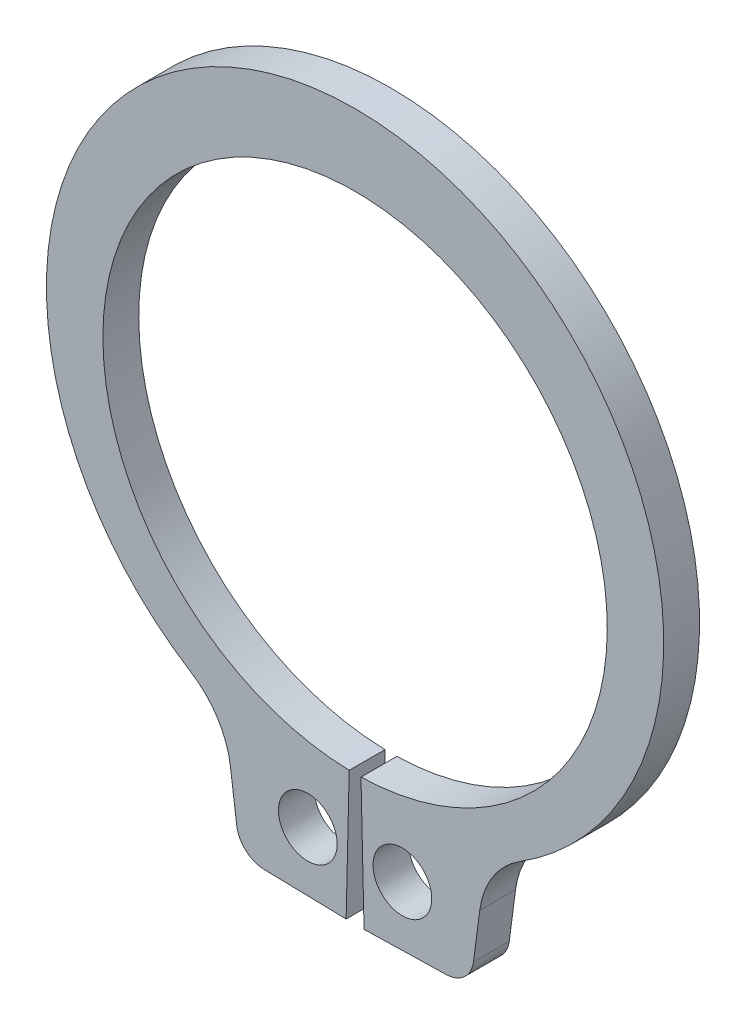
ISO-10303-21;
HEADER;
FILE_DESCRIPTION(('STEP AP214'),'2;1');
FILE_NAME('part.step','',(''),(''),'','','');
FILE_SCHEMA(('AUTOMOTIVE_DESIGN { 1 0 10303 214 1 1 1 1 }'));
ENDSEC;
DATA;
#1=APPLICATION_CONTEXT('core data for automotive mechanical design processes');
#2=APPLICATION_PROTOCOL_DEFINITION('international standard','automotive_design',2000,#1);
#3=PRODUCT_CONTEXT('',#1,'mechanical');
#4=PRODUCT('Part','Part','',(#3));
#5=PRODUCT_RELATED_PRODUCT_CATEGORY('part','',(#4));
#6=PRODUCT_DEFINITION_FORMATION('','',#4);
#7=PRODUCT_DEFINITION_CONTEXT('part definition',#1,'design');
#8=PRODUCT_DEFINITION('design','',#6,#7);
#9=PRODUCT_DEFINITION_SHAPE('','',#8);
#10=(LENGTH_UNIT() NAMED_UNIT(*) SI_UNIT(.MILLI.,.METRE.));
#11=(NAMED_UNIT(*) PLANE_ANGLE_UNIT() SI_UNIT($,.RADIAN.));
#12=(NAMED_UNIT(*) SI_UNIT($,.STERADIAN.) SOLID_ANGLE_UNIT());
#13=UNCERTAINTY_MEASURE_WITH_UNIT(LENGTH_MEASURE(1.E-05),#10,'distance_accuracy_value','');
#14=(GEOMETRIC_REPRESENTATION_CONTEXT(3) GLOBAL_UNCERTAINTY_ASSIGNED_CONTEXT((#13)) GLOBAL_UNIT_ASSIGNED_CONTEXT((#10,
#11,#12)) REPRESENTATION_CONTEXT('',''));
#15=CARTESIAN_POINT('',(0.,0.,0.));
#16=DIRECTION('',(0.,0.,1.));
#17=DIRECTION('',(1.,0.,0.));
#18=AXIS2_PLACEMENT_3D('',#15,#16,#17);
#19=CARTESIAN_POINT('',(0.,0.,-0.635));
#20=DIRECTION('',(0.,0.,1.));
#21=DIRECTION('',(1.,0.,0.));
#22=AXIS2_PLACEMENT_3D('',#19,#20,#21);
#23=CYLINDRICAL_SURFACE('',#22,4.4704);
#24=CARTESIAN_POINT('',(0.,0.,0.));
#25=DIRECTION('',(0.,0.,-1.));
#26=DIRECTION('',(1.,0.,0.));
#27=AXIS2_PLACEMENT_3D('',#24,#25,#26);
#28=CIRCLE('',#27,4.4704);
#29=CARTESIAN_POINT('',(-0.104644194756554,-4.46917506398035,0.));
#30=VERTEX_POINT('',#29);
#31=CARTESIAN_POINT('',(0.104644194756554,-4.46917506398035,0.));
#32=VERTEX_POINT('',#31);
#33=EDGE_CURVE('E157',#30,#32,#28,.T.);
#34=ORIENTED_EDGE('',*,*,#33,.F.);
#35=DIRECTION('',(0.,0.,1.));
#36=VECTOR('',#35,1.);
#37=CARTESIAN_POINT('',(-0.104644194756554,-4.46917506398035,-0.635));
#38=LINE('',#37,#36);
#39=CARTESIAN_POINT('',(-0.104644194756554,-4.46917506398035,-0.635));
#40=VERTEX_POINT('',#39);
#41=EDGE_CURVE('E11',#40,#30,#38,.T.);
#42=ORIENTED_EDGE('',*,*,#41,.F.);
#43=CARTESIAN_POINT('',(0.,0.,-0.635));
#44=DIRECTION('',(0.,0.,-1.));
#45=DIRECTION('',(1.,0.,0.));
#46=AXIS2_PLACEMENT_3D('',#43,#44,#45);
#47=CIRCLE('',#46,4.4704);
#48=CARTESIAN_POINT('',(0.104644194756554,-4.46917506398035,-0.635));
#49=VERTEX_POINT('',#48);
#50=EDGE_CURVE('E190',#40,#49,#47,.T.);
#51=ORIENTED_EDGE('',*,*,#50,.T.);
#52=DIRECTION('',(0.,0.,1.));
#53=VECTOR('',#52,1.);
#54=CARTESIAN_POINT('',(0.104644194756554,-4.46917506398035,-0.635));
#55=LINE('',#54,#53);
#56=EDGE_CURVE('E39',#49,#32,#55,.T.);
#57=ORIENTED_EDGE('',*,*,#56,.T.);
#58=EDGE_LOOP('',(#34,#42,#51,#57));
#59=FACE_BOUND('',#58,.T.);
#60=ADVANCED_FACE('F36',(#59),#23,.F.);
#61=CARTESIAN_POINT('',(-0.104644194756554,-4.46917506398035,-0.635));
#62=DIRECTION('',(0.99972598961622,-0.0234082397003745,0.));
#63=DIRECTION('',(0.0234082397003745,0.99972598961622,0.));
#64=AXIS2_PLACEMENT_3D('',#61,#62,#63);
#65=PLANE('',#64);
#66=DIRECTION('',(0.0234082397003745,0.99972598961622,0.));
#67=VECTOR('',#66,1.);
#68=CARTESIAN_POINT('',(-0.104644194756554,-4.46917506398035,0.));
#69=LINE('',#68,#67);
#70=CARTESIAN_POINT('',(-0.15875,-6.77994171637928,0.));
#71=VERTEX_POINT('',#70);
#72=EDGE_CURVE('E188',#71,#30,#69,.T.);
#73=ORIENTED_EDGE('',*,*,#72,.F.);
#74=DIRECTION('',(0.,0.,1.));
#75=VECTOR('',#74,1.);
#76=CARTESIAN_POINT('',(-0.15875,-6.77994171637928,-0.635));
#77=LINE('',#76,#75);
#78=CARTESIAN_POINT('',(-0.15875,-6.77994171637928,-0.635));
#79=VERTEX_POINT('',#78);
#80=EDGE_CURVE('E45',#79,#71,#77,.T.);
#81=ORIENTED_EDGE('',*,*,#80,.F.);
#82=DIRECTION('',(0.0234082397003745,0.99972598961622,0.));
#83=VECTOR('',#82,1.);
#84=CARTESIAN_POINT('',(-0.104644194756554,-4.46917506398035,-0.635));
#85=LINE('',#84,#83);
#86=EDGE_CURVE('E147',#79,#40,#85,.T.);
#87=ORIENTED_EDGE('',*,*,#86,.T.);
#88=ORIENTED_EDGE('',*,*,#41,.T.);
#89=EDGE_LOOP('',(#73,#81,#87,#88));
#90=FACE_BOUND('',#89,.T.);
#91=ADVANCED_FACE('F210',(#90),#65,.T.);
#92=CARTESIAN_POINT('',(-0.15875,-6.77994171637928,-0.635));
#93=DIRECTION('',(-0.0234082397003748,-0.99972598961622,0.));
#94=DIRECTION('',(0.99972598961622,-0.0234082397003748,0.));
#95=AXIS2_PLACEMENT_3D('',#92,#93,#94);
#96=PLANE('',#95);
#97=DIRECTION('',(0.99972598961622,-0.0234082397003748,0.));
#98=VECTOR('',#97,1.);
#99=CARTESIAN_POINT('',(-0.15875,-6.77994171637928,0.));
#100=LINE('',#99,#98);
#101=CARTESIAN_POINT('',(-1.61409910187213,-6.74586521844065,0.));
#102=VERTEX_POINT('',#101);
#103=EDGE_CURVE('E134',#102,#71,#100,.T.);
#104=ORIENTED_EDGE('',*,*,#103,.F.);
#105=DIRECTION('',(0.,0.,1.));
#106=VECTOR('',#105,1.);
#107=CARTESIAN_POINT('',(-1.61409910187213,-6.74586521844065,-0.635));
#108=LINE('',#107,#106);
#109=CARTESIAN_POINT('',(-1.61409910187213,-6.74586521844065,-0.635));
#110=VERTEX_POINT('',#109);
#111=EDGE_CURVE('E129',#110,#102,#108,.T.);
#112=ORIENTED_EDGE('',*,*,#111,.F.);
#113=DIRECTION('',(0.99972598961622,-0.0234082397003748,0.));
#114=VECTOR('',#113,1.);
#115=CARTESIAN_POINT('',(-0.15875,-6.77994171637928,-0.635));
#116=LINE('',#115,#114);
#117=EDGE_CURVE('E132',#110,#79,#116,.T.);
#118=ORIENTED_EDGE('',*,*,#117,.T.);
#119=ORIENTED_EDGE('',*,*,#80,.T.);
#120=EDGE_LOOP('',(#104,#112,#118,#119));
#121=FACE_BOUND('',#120,.T.);
#122=ADVANCED_FACE('F131',(#121),#96,.T.);
#123=CARTESIAN_POINT('',(-1.60239498202195,-6.24600222363254,-0.635));
#124=DIRECTION('',(0.,0.,1.));
#125=DIRECTION('',(1.,0.,0.));
#126=AXIS2_PLACEMENT_3D('',#123,#124,#125);
#127=CYLINDRICAL_SURFACE('',#126,0.5);
#128=CARTESIAN_POINT('',(-1.60239498202195,-6.24600222363254,0.));
#129=DIRECTION('',(0.,0.,1.));
#130=DIRECTION('',(1.,0.,0.));
#131=AXIS2_PLACEMENT_3D('',#128,#129,#130);
#132=CIRCLE('',#131,0.5);
#133=CARTESIAN_POINT('',(-2.09811741270885,-6.31126531974257,0.));
#134=VERTEX_POINT('',#133);
#135=EDGE_CURVE('E185',#134,#102,#132,.T.);
#136=ORIENTED_EDGE('',*,*,#135,.F.);
#137=DIRECTION('',(0.,0.,1.));
#138=VECTOR('',#137,1.);
#139=CARTESIAN_POINT('',(-2.09811741270885,-6.31126531974257,-0.635));
#140=LINE('',#139,#138);
#141=CARTESIAN_POINT('',(-2.09811741270885,-6.31126531974257,-0.635));
#142=VERTEX_POINT('',#141);
#143=EDGE_CURVE('E139',#142,#134,#140,.T.);
#144=ORIENTED_EDGE('',*,*,#143,.F.);
#145=CARTESIAN_POINT('',(-1.60239498202195,-6.24600222363254,-0.635));
#146=DIRECTION('',(0.,0.,1.));
#147=DIRECTION('',(1.,0.,0.));
#148=AXIS2_PLACEMENT_3D('',#145,#146,#147);
#149=CIRCLE('',#148,0.5);
#150=EDGE_CURVE('E145',#142,#110,#149,.T.);
#151=ORIENTED_EDGE('',*,*,#150,.T.);
#152=ORIENTED_EDGE('',*,*,#111,.T.);
#153=EDGE_LOOP('',(#136,#144,#151,#152));
#154=FACE_BOUND('',#153,.T.);
#155=ADVANCED_FACE('F149',(#154),#127,.T.);
#156=CARTESIAN_POINT('',(-2.21001393120872,-5.46132687914755,-0.635));
#157=DIRECTION('',(-0.99144486137381,-0.130526192220053,0.));
#158=DIRECTION('',(0.130526192220053,-0.99144486137381,0.));
#159=AXIS2_PLACEMENT_3D('',#156,#157,#158);
#160=PLANE('',#159);
#161=DIRECTION('',(0.130526192220053,-0.99144486137381,0.));
#162=VECTOR('',#161,1.);
#163=CARTESIAN_POINT('',(-2.21001393120872,-5.46132687914755,0.));
#164=LINE('',#163,#162);
#165=CARTESIAN_POINT('',(-2.21001393120872,-5.46132687914755,0.));
#166=VERTEX_POINT('',#165);
#167=EDGE_CURVE('E182',#166,#134,#164,.T.);
#168=ORIENTED_EDGE('',*,*,#167,.F.);
#169=DIRECTION('',(0.,0.,1.));
#170=VECTOR('',#169,1.);
#171=CARTESIAN_POINT('',(-2.21001393120872,-5.46132687914755,-0.635));
#172=LINE('',#171,#170);
#173=CARTESIAN_POINT('',(-2.21001393120872,-5.46132687914755,-0.635));
#174=VERTEX_POINT('',#173);
#175=EDGE_CURVE('E194',#174,#166,#172,.T.);
#176=ORIENTED_EDGE('',*,*,#175,.F.);
#177=DIRECTION('',(0.130526192220053,-0.99144486137381,0.));
#178=VECTOR('',#177,1.);
#179=CARTESIAN_POINT('',(-2.21001393120872,-5.46132687914755,-0.635));
#180=LINE('',#179,#178);
#181=EDGE_CURVE('E150',#174,#142,#180,.T.);
#182=ORIENTED_EDGE('',*,*,#181,.T.);
#183=ORIENTED_EDGE('',*,*,#143,.T.);
#184=EDGE_LOOP('',(#168,#176,#182,#183));
#185=FACE_BOUND('',#184,.T.);
#186=ADVANCED_FACE('F223',(#185),#160,.T.);
#187=CARTESIAN_POINT('',(-3.73313206779057,-5.66184918594921,-0.635));
#188=DIRECTION('',(0.,0.,1.));
#189=DIRECTION('',(1.,0.,0.));
#190=AXIS2_PLACEMENT_3D('',#187,#188,#189);
#191=CYLINDRICAL_SURFACE('',#190,1.53626106294132);
#192=CARTESIAN_POINT('',(-3.73313206779057,-5.66184918594921,0.));
#193=DIRECTION('',(0.,0.,-1.));
#194=DIRECTION('',(1.,0.,0.));
#195=AXIS2_PLACEMENT_3D('',#192,#193,#194);
#196=CIRCLE('',#195,1.53626106294132);
#197=CARTESIAN_POINT('',(-2.91475044430294,-4.36171474219066,0.));
#198=VERTEX_POINT('',#197);
#199=EDGE_CURVE('E179',#198,#166,#196,.T.);
#200=ORIENTED_EDGE('',*,*,#199,.F.);
#201=DIRECTION('',(0.,0.,1.));
#202=VECTOR('',#201,1.);
#203=CARTESIAN_POINT('',(-2.91475044430294,-4.36171474219066,-0.635));
#204=LINE('',#203,#202);
#205=CARTESIAN_POINT('',(-2.91475044430294,-4.36171474219066,-0.635));
#206=VERTEX_POINT('',#205);
#207=EDGE_CURVE('E196',#206,#198,#204,.T.);
#208=ORIENTED_EDGE('',*,*,#207,.F.);
#209=CARTESIAN_POINT('',(-3.73313206779057,-5.66184918594921,-0.635));
#210=DIRECTION('',(0.,0.,-1.));
#211=DIRECTION('',(1.,0.,0.));
#212=AXIS2_PLACEMENT_3D('',#209,#210,#211);
#213=CIRCLE('',#212,1.53626106294132);
#214=EDGE_CURVE('E152',#206,#174,#213,.T.);
#215=ORIENTED_EDGE('',*,*,#214,.T.);
#216=ORIENTED_EDGE('',*,*,#175,.T.);
#217=EDGE_LOOP('',(#200,#208,#215,#216));
#218=FACE_BOUND('',#217,.T.);
#219=ADVANCED_FACE('F226',(#218),#191,.F.);
#220=CARTESIAN_POINT('',(0.,0.268847991426327,-0.635));
#221=DIRECTION('',(0.,0.,1.));
#222=DIRECTION('',(1.,0.,0.));
#223=AXIS2_PLACEMENT_3D('',#220,#221,#222);
#224=CYLINDRICAL_SURFACE('',#223,5.47155200857367);
#225=CARTESIAN_POINT('',(0.,0.268847991426327,0.));
#226=DIRECTION('',(0.,0.,1.));
#227=DIRECTION('',(1.,0.,0.));
#228=AXIS2_PLACEMENT_3D('',#225,#226,#227);
#229=CIRCLE('',#228,5.47155200857367);
#230=CARTESIAN_POINT('',(2.91475044430293,-4.36171474219066,0.));
#231=VERTEX_POINT('',#230);
#232=EDGE_CURVE('E176',#231,#198,#229,.T.);
#233=ORIENTED_EDGE('',*,*,#232,.F.);
#234=DIRECTION('',(0.,0.,1.));
#235=VECTOR('',#234,1.);
#236=CARTESIAN_POINT('',(2.91475044430293,-4.36171474219066,-0.635));
#237=LINE('',#236,#235);
#238=CARTESIAN_POINT('',(2.91475044430293,-4.36171474219066,-0.635));
#239=VERTEX_POINT('',#238);
#240=EDGE_CURVE('E198',#239,#231,#237,.T.);
#241=ORIENTED_EDGE('',*,*,#240,.F.);
#242=CARTESIAN_POINT('',(0.,0.268847991426327,-0.635));
#243=DIRECTION('',(0.,0.,1.));
#244=DIRECTION('',(1.,0.,0.));
#245=AXIS2_PLACEMENT_3D('',#242,#243,#244);
#246=CIRCLE('',#245,5.47155200857367);
#247=EDGE_CURVE('E300',#239,#206,#246,.T.);
#248=ORIENTED_EDGE('',*,*,#247,.T.);
#249=ORIENTED_EDGE('',*,*,#207,.T.);
#250=EDGE_LOOP('',(#233,#241,#248,#249));
#251=FACE_BOUND('',#250,.T.);
#252=ADVANCED_FACE('F230',(#251),#224,.T.);
#253=CARTESIAN_POINT('',(3.73313206779057,-5.66184918594921,-0.635));
#254=DIRECTION('',(0.,0.,1.));
#255=DIRECTION('',(1.,0.,0.));
#256=AXIS2_PLACEMENT_3D('',#253,#254,#255);
#257=CYLINDRICAL_SURFACE('',#256,1.53626106294132);
#258=CARTESIAN_POINT('',(3.73313206779057,-5.66184918594921,0.));
#259=DIRECTION('',(0.,0.,-1.));
#260=DIRECTION('',(1.,0.,0.));
#261=AXIS2_PLACEMENT_3D('',#258,#259,#260);
#262=CIRCLE('',#261,1.53626106294132);
#263=CARTESIAN_POINT('',(2.21001393120872,-5.46132687914755,0.));
#264=VERTEX_POINT('',#263);
#265=EDGE_CURVE('E173',#264,#231,#262,.T.);
#266=ORIENTED_EDGE('',*,*,#265,.F.);
#267=DIRECTION('',(0.,0.,1.));
#268=VECTOR('',#267,1.);
#269=CARTESIAN_POINT('',(2.21001393120872,-5.46132687914755,-0.635));
#270=LINE('',#269,#268);
#271=CARTESIAN_POINT('',(2.21001393120872,-5.46132687914755,-0.635));
#272=VERTEX_POINT('',#271);
#273=EDGE_CURVE('E200',#272,#264,#270,.T.);
#274=ORIENTED_EDGE('',*,*,#273,.F.);
#275=CARTESIAN_POINT('',(3.73313206779057,-5.66184918594921,-0.635));
#276=DIRECTION('',(0.,0.,-1.));
#277=DIRECTION('',(1.,0.,0.));
#278=AXIS2_PLACEMENT_3D('',#275,#276,#277);
#279=CIRCLE('',#278,1.53626106294132);
#280=EDGE_CURVE('E297',#272,#239,#279,.T.);
#281=ORIENTED_EDGE('',*,*,#280,.T.);
#282=ORIENTED_EDGE('',*,*,#240,.T.);
#283=EDGE_LOOP('',(#266,#274,#281,#282));
#284=FACE_BOUND('',#283,.T.);
#285=ADVANCED_FACE('F234',(#284),#257,.F.);
#286=CARTESIAN_POINT('',(2.21001393120872,-5.46132687914755,-0.635));
#287=DIRECTION('',(0.99144486137381,-0.130526192220053,0.));
#288=DIRECTION('',(0.130526192220053,0.99144486137381,0.));
#289=AXIS2_PLACEMENT_3D('',#286,#287,#288);
#290=PLANE('',#289);
#291=DIRECTION('',(0.130526192220053,0.99144486137381,0.));
#292=VECTOR('',#291,1.);
#293=CARTESIAN_POINT('',(2.21001393120872,-5.46132687914755,0.));
#294=LINE('',#293,#292);
#295=CARTESIAN_POINT('',(2.09811741270885,-6.31126531974257,0.));
#296=VERTEX_POINT('',#295);
#297=EDGE_CURVE('E170',#296,#264,#294,.T.);
#298=ORIENTED_EDGE('',*,*,#297,.F.);
#299=DIRECTION('',(0.,0.,1.));
#300=VECTOR('',#299,1.);
#301=CARTESIAN_POINT('',(2.09811741270885,-6.31126531974257,-0.635));
#302=LINE('',#301,#300);
#303=CARTESIAN_POINT('',(2.09811741270885,-6.31126531974257,-0.635));
#304=VERTEX_POINT('',#303);
#305=EDGE_CURVE('E202',#304,#296,#302,.T.);
#306=ORIENTED_EDGE('',*,*,#305,.F.);
#307=DIRECTION('',(0.130526192220053,0.99144486137381,0.));
#308=VECTOR('',#307,1.);
#309=CARTESIAN_POINT('',(2.21001393120872,-5.46132687914755,-0.635));
#310=LINE('',#309,#308);
#311=EDGE_CURVE('E294',#304,#272,#310,.T.);
#312=ORIENTED_EDGE('',*,*,#311,.T.);
#313=ORIENTED_EDGE('',*,*,#273,.T.);
#314=EDGE_LOOP('',(#298,#306,#312,#313));
#315=FACE_BOUND('',#314,.T.);
#316=ADVANCED_FACE('F238',(#315),#290,.T.);
#317=CARTESIAN_POINT('',(1.60239498202195,-6.24600222363254,-0.635));
#318=DIRECTION('',(0.,0.,1.));
#319=DIRECTION('',(1.,0.,0.));
#320=AXIS2_PLACEMENT_3D('',#317,#318,#319);
#321=CYLINDRICAL_SURFACE('',#320,0.5);
#322=CARTESIAN_POINT('',(1.60239498202195,-6.24600222363254,0.));
#323=DIRECTION('',(0.,0.,1.));
#324=DIRECTION('',(-1.,0.,0.));
#325=AXIS2_PLACEMENT_3D('',#322,#323,#324);
#326=CIRCLE('',#325,0.5);
#327=CARTESIAN_POINT('',(1.61409910187213,-6.74586521844065,0.));
#328=VERTEX_POINT('',#327);
#329=EDGE_CURVE('E167',#328,#296,#326,.T.);
#330=ORIENTED_EDGE('',*,*,#329,.F.);
#331=DIRECTION('',(0.,0.,1.));
#332=VECTOR('',#331,1.);
#333=CARTESIAN_POINT('',(1.61409910187213,-6.74586521844065,-0.635));
#334=LINE('',#333,#332);
#335=CARTESIAN_POINT('',(1.61409910187213,-6.74586521844065,-0.635));
#336=VERTEX_POINT('',#335);
#337=EDGE_CURVE('E204',#336,#328,#334,.T.);
#338=ORIENTED_EDGE('',*,*,#337,.F.);
#339=CARTESIAN_POINT('',(1.60239498202195,-6.24600222363254,-0.635));
#340=DIRECTION('',(0.,0.,1.));
#341=DIRECTION('',(-1.,0.,0.));
#342=AXIS2_PLACEMENT_3D('',#339,#340,#341);
#343=CIRCLE('',#342,0.5);
#344=EDGE_CURVE('E291',#336,#304,#343,.T.);
#345=ORIENTED_EDGE('',*,*,#344,.T.);
#346=ORIENTED_EDGE('',*,*,#305,.T.);
#347=EDGE_LOOP('',(#330,#338,#345,#346));
#348=FACE_BOUND('',#347,.T.);
#349=ADVANCED_FACE('F242',(#348),#321,.T.);
#350=CARTESIAN_POINT('',(0.15875,-6.77994171637928,-0.635));
#351=DIRECTION('',(0.0234082397003748,-0.99972598961622,0.));
#352=DIRECTION('',(0.99972598961622,0.0234082397003748,0.));
#353=AXIS2_PLACEMENT_3D('',#350,#351,#352);
#354=PLANE('',#353);
#355=DIRECTION('',(0.99972598961622,0.0234082397003748,0.));
#356=VECTOR('',#355,1.);
#357=CARTESIAN_POINT('',(0.15875,-6.77994171637928,0.));
#358=LINE('',#357,#356);
#359=CARTESIAN_POINT('',(0.15875,-6.77994171637928,0.));
#360=VERTEX_POINT('',#359);
#361=EDGE_CURVE('E164',#360,#328,#358,.T.);
#362=ORIENTED_EDGE('',*,*,#361,.F.);
#363=DIRECTION('',(0.,0.,1.));
#364=VECTOR('',#363,1.);
#365=CARTESIAN_POINT('',(0.15875,-6.77994171637928,-0.635));
#366=LINE('',#365,#364);
#367=CARTESIAN_POINT('',(0.15875,-6.77994171637928,-0.635));
#368=VERTEX_POINT('',#367);
#369=EDGE_CURVE('E205',#368,#360,#366,.T.);
#370=ORIENTED_EDGE('',*,*,#369,.F.);
#371=DIRECTION('',(0.99972598961622,0.0234082397003748,0.));
#372=VECTOR('',#371,1.);
#373=CARTESIAN_POINT('',(0.15875,-6.77994171637928,-0.635));
#374=LINE('',#373,#372);
#375=EDGE_CURVE('E288',#368,#336,#374,.T.);
#376=ORIENTED_EDGE('',*,*,#375,.T.);
#377=ORIENTED_EDGE('',*,*,#337,.T.);
#378=EDGE_LOOP('',(#362,#370,#376,#377));
#379=FACE_BOUND('',#378,.T.);
#380=ADVANCED_FACE('F246',(#379),#354,.T.);
#381=CARTESIAN_POINT('',(0.104644194756554,-4.46917506398035,-0.635));
#382=DIRECTION('',(-0.99972598961622,-0.0234082397003745,0.));
#383=DIRECTION('',(0.0234082397003745,-0.99972598961622,0.));
#384=AXIS2_PLACEMENT_3D('',#381,#382,#383);
#385=PLANE('',#384);
#386=DIRECTION('',(0.0234082397003745,-0.99972598961622,0.));
#387=VECTOR('',#386,1.);
#388=CARTESIAN_POINT('',(0.104644194756554,-4.46917506398035,0.));
#389=LINE('',#388,#387);
#390=EDGE_CURVE('E160',#32,#360,#389,.T.);
#391=ORIENTED_EDGE('',*,*,#390,.F.);
#392=ORIENTED_EDGE('',*,*,#56,.F.);
#393=DIRECTION('',(0.0234082397003745,-0.99972598961622,0.));
#394=VECTOR('',#393,1.);
#395=CARTESIAN_POINT('',(0.104644194756554,-4.46917506398035,-0.635));
#396=LINE('',#395,#394);
#397=EDGE_CURVE('E286',#49,#368,#396,.T.);
#398=ORIENTED_EDGE('',*,*,#397,.T.);
#399=ORIENTED_EDGE('',*,*,#369,.T.);
#400=EDGE_LOOP('',(#391,#392,#398,#399));
#401=FACE_BOUND('',#400,.T.);
#402=ADVANCED_FACE('F207',(#401),#385,.T.);
#403=CARTESIAN_POINT('',(0.,0.,-0.635));
#404=DIRECTION('',(0.,0.,1.));
#405=DIRECTION('',(1.,0.,0.));
#406=AXIS2_PLACEMENT_3D('',#403,#404,#405);
#407=PLANE('',#406);
#408=CARTESIAN_POINT('',(-0.8382,-5.71096632650728,-0.635));
#409=DIRECTION('',(0.,0.,1.));
#410=DIRECTION('',(1.,0.,0.));
#411=AXIS2_PLACEMENT_3D('',#408,#409,#410);
#412=CIRCLE('',#411,0.5207);
#413=CARTESIAN_POINT('',(-0.3175,-5.71096632650728,-0.635));
#414=VERTEX_POINT('',#413);
#415=EDGE_CURVE('E273',#414,#414,#412,.T.);
#416=ORIENTED_EDGE('',*,*,#415,.T.);
#417=EDGE_LOOP('',(#416));
#418=FACE_BOUND('',#417,.T.);
#419=CARTESIAN_POINT('',(0.8382,-5.71096632650728,-0.635));
#420=DIRECTION('',(0.,0.,1.));
#421=DIRECTION('',(1.,0.,0.));
#422=AXIS2_PLACEMENT_3D('',#419,#420,#421);
#423=CIRCLE('',#422,0.5207);
#424=CARTESIAN_POINT('',(1.3589,-5.71096632650728,-0.635));
#425=VERTEX_POINT('',#424);
#426=EDGE_CURVE('E161',#425,#425,#423,.T.);
#427=ORIENTED_EDGE('',*,*,#426,.T.);
#428=EDGE_LOOP('',(#427));
#429=FACE_BOUND('',#428,.T.);
#430=ORIENTED_EDGE('',*,*,#50,.F.);
#431=ORIENTED_EDGE('',*,*,#86,.F.);
#432=ORIENTED_EDGE('',*,*,#117,.F.);
#433=ORIENTED_EDGE('',*,*,#150,.F.);
#434=ORIENTED_EDGE('',*,*,#181,.F.);
#435=ORIENTED_EDGE('',*,*,#214,.F.);
#436=ORIENTED_EDGE('',*,*,#247,.F.);
#437=ORIENTED_EDGE('',*,*,#280,.F.);
#438=ORIENTED_EDGE('',*,*,#311,.F.);
#439=ORIENTED_EDGE('',*,*,#344,.F.);
#440=ORIENTED_EDGE('',*,*,#375,.F.);
#441=ORIENTED_EDGE('',*,*,#397,.F.);
#442=EDGE_LOOP('',(#430,#431,#432,#433,#434,#435,#436,#437,#438,#439,#440,#441));
#443=FACE_BOUND('',#442,.T.);
#444=ADVANCED_FACE('F143',(#418,#429,#443),#407,.F.);
#445=CARTESIAN_POINT('',(0.,0.,0.));
#446=DIRECTION('',(0.,0.,1.));
#447=DIRECTION('',(1.,0.,0.));
#448=AXIS2_PLACEMENT_3D('',#445,#446,#447);
#449=PLANE('',#448);
#450=CARTESIAN_POINT('',(-0.8382,-5.71096632650728,0.));
#451=DIRECTION('',(0.,0.,1.));
#452=DIRECTION('',(1.,0.,0.));
#453=AXIS2_PLACEMENT_3D('',#450,#451,#452);
#454=CIRCLE('',#453,0.5207);
#455=CARTESIAN_POINT('',(-0.3175,-5.71096632650728,0.));
#456=VERTEX_POINT('',#455);
#457=EDGE_CURVE('E276',#456,#456,#454,.T.);
#458=ORIENTED_EDGE('',*,*,#457,.F.);
#459=EDGE_LOOP('',(#458));
#460=FACE_BOUND('',#459,.T.);
#461=CARTESIAN_POINT('',(0.8382,-5.71096632650728,0.));
#462=DIRECTION('',(0.,0.,1.));
#463=DIRECTION('',(1.,0.,0.));
#464=AXIS2_PLACEMENT_3D('',#461,#462,#463);
#465=CIRCLE('',#464,0.5207);
#466=CARTESIAN_POINT('',(1.3589,-5.71096632650728,0.));
#467=VERTEX_POINT('',#466);
#468=EDGE_CURVE('E278',#467,#467,#465,.T.);
#469=ORIENTED_EDGE('',*,*,#468,.F.);
#470=EDGE_LOOP('',(#469));
#471=FACE_BOUND('',#470,.T.);
#472=ORIENTED_EDGE('',*,*,#33,.T.);
#473=ORIENTED_EDGE('',*,*,#390,.T.);
#474=ORIENTED_EDGE('',*,*,#361,.T.);
#475=ORIENTED_EDGE('',*,*,#329,.T.);
#476=ORIENTED_EDGE('',*,*,#297,.T.);
#477=ORIENTED_EDGE('',*,*,#265,.T.);
#478=ORIENTED_EDGE('',*,*,#232,.T.);
#479=ORIENTED_EDGE('',*,*,#199,.T.);
#480=ORIENTED_EDGE('',*,*,#167,.T.);
#481=ORIENTED_EDGE('',*,*,#135,.T.);
#482=ORIENTED_EDGE('',*,*,#103,.T.);
#483=ORIENTED_EDGE('',*,*,#72,.T.);
#484=EDGE_LOOP('',(#472,#473,#474,#475,#476,#477,#478,#479,#480,#481,#482,#483));
#485=FACE_BOUND('',#484,.T.);
#486=ADVANCED_FACE('F209',(#460,#471,#485),#449,.T.);
#487=CARTESIAN_POINT('',(0.8382,-5.71096632650728,-0.635));
#488=DIRECTION('',(0.,0.,1.));
#489=DIRECTION('',(1.,0.,0.));
#490=AXIS2_PLACEMENT_3D('',#487,#488,#489);
#491=CYLINDRICAL_SURFACE('',#490,0.5207);
#492=ORIENTED_EDGE('',*,*,#426,.F.);
#493=EDGE_LOOP('',(#492));
#494=FACE_BOUND('',#493,.T.);
#495=ORIENTED_EDGE('',*,*,#468,.T.);
#496=EDGE_LOOP('',(#495));
#497=FACE_BOUND('',#496,.T.);
#498=ADVANCED_FACE('F258',(#494,#497),#491,.F.);
#499=CARTESIAN_POINT('',(-0.8382,-5.71096632650728,-0.635));
#500=DIRECTION('',(0.,0.,1.));
#501=DIRECTION('',(1.,0.,0.));
#502=AXIS2_PLACEMENT_3D('',#499,#500,#501);
#503=CYLINDRICAL_SURFACE('',#502,0.5207);
#504=ORIENTED_EDGE('',*,*,#415,.F.);
#505=EDGE_LOOP('',(#504));
#506=FACE_BOUND('',#505,.T.);
#507=ORIENTED_EDGE('',*,*,#457,.T.);
#508=EDGE_LOOP('',(#507));
#509=FACE_BOUND('',#508,.T.);
#510=ADVANCED_FACE('F265',(#506,#509),#503,.F.);
#511=CLOSED_SHELL('',(#60,#91,#122,#155,#186,#219,#252,#285,#316,#349,#380,#402,#444,#486,#498,#510));
#512=MANIFOLD_SOLID_BREP('B2',#511);
#513=ADVANCED_BREP_SHAPE_REPRESENTATION('',(#18,#512),#14);
#514=SHAPE_DEFINITION_REPRESENTATION(#9,#513);
ENDSEC;
END-ISO-10303-21;
